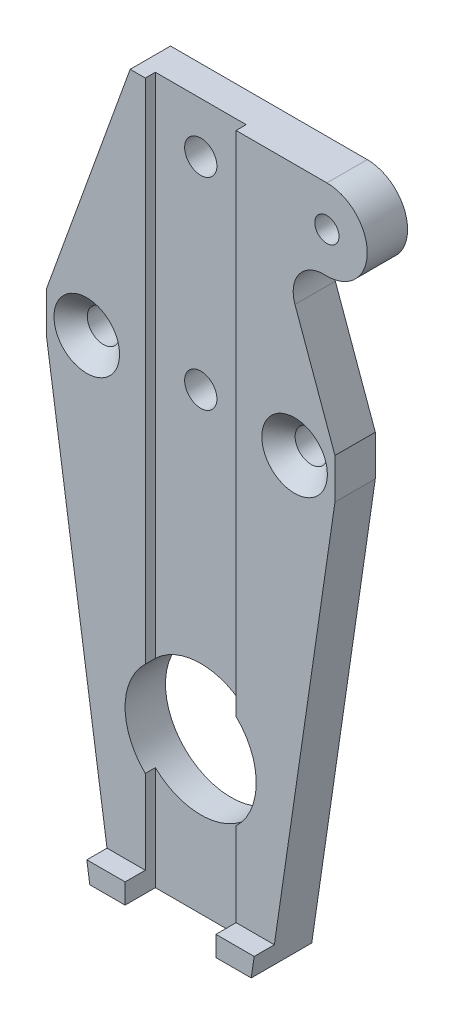
ISO-10303-21;
HEADER;
FILE_DESCRIPTION(('STEP AP214'),'2;1');
FILE_NAME('part.step','',(''),(''),'','','');
FILE_SCHEMA(('AUTOMOTIVE_DESIGN { 1 0 10303 214 1 1 1 1 }'));
ENDSEC;
DATA;
#1=APPLICATION_CONTEXT('core data for automotive mechanical design processes');
#2=APPLICATION_PROTOCOL_DEFINITION('international standard','automotive_design',2000,#1);
#3=PRODUCT_CONTEXT('',#1,'mechanical');
#4=PRODUCT('Part','Part','',(#3));
#5=PRODUCT_RELATED_PRODUCT_CATEGORY('part','',(#4));
#6=PRODUCT_DEFINITION_FORMATION('','',#4);
#7=PRODUCT_DEFINITION_CONTEXT('part definition',#1,'design');
#8=PRODUCT_DEFINITION('design','',#6,#7);
#9=PRODUCT_DEFINITION_SHAPE('','',#8);
#10=(LENGTH_UNIT() NAMED_UNIT(*) SI_UNIT(.MILLI.,.METRE.));
#11=(NAMED_UNIT(*) PLANE_ANGLE_UNIT() SI_UNIT($,.RADIAN.));
#12=(NAMED_UNIT(*) SI_UNIT($,.STERADIAN.) SOLID_ANGLE_UNIT());
#13=UNCERTAINTY_MEASURE_WITH_UNIT(LENGTH_MEASURE(1.E-05),#10,'distance_accuracy_value','');
#14=(GEOMETRIC_REPRESENTATION_CONTEXT(3) GLOBAL_UNCERTAINTY_ASSIGNED_CONTEXT((#13)) GLOBAL_UNIT_ASSIGNED_CONTEXT((#10,
#11,#12)) REPRESENTATION_CONTEXT('',''));
#15=CARTESIAN_POINT('',(0.,0.,0.));
#16=DIRECTION('',(0.,0.,1.));
#17=DIRECTION('',(1.,0.,0.));
#18=AXIS2_PLACEMENT_3D('',#15,#16,#17);
#19=CARTESIAN_POINT('',(0.,0.,3.));
#20=DIRECTION('',(0.,0.,1.));
#21=DIRECTION('',(1.,0.,0.));
#22=AXIS2_PLACEMENT_3D('',#19,#20,#21);
#23=PLANE('',#22);
#24=DIRECTION('',(-1.,0.,0.));
#25=VECTOR('',#24,1.);
#26=CARTESIAN_POINT('',(0.,-37.5454545454545,3.));
#27=LINE('',#26,#25);
#28=CARTESIAN_POINT('',(28.040606060556,-37.5454545454545,3.));
#29=VERTEX_POINT('',#28);
#30=CARTESIAN_POINT('',(19.0406060605561,-37.5454545454545,3.));
#31=VERTEX_POINT('',#30);
#32=EDGE_CURVE('E561',#29,#31,#27,.T.);
#33=ORIENTED_EDGE('',*,*,#32,.F.);
#34=DIRECTION('',(0.,1.,0.));
#35=VECTOR('',#34,1.);
#36=CARTESIAN_POINT('',(28.040606060556,0.,3.));
#37=LINE('',#36,#35);
#38=CARTESIAN_POINT('',(28.040606060556,-27.2358703052891,3.));
#39=VERTEX_POINT('',#38);
#40=EDGE_CURVE('E419',#29,#39,#37,.T.);
#41=ORIENTED_EDGE('',*,*,#40,.T.);
#42=CARTESIAN_POINT('',(23.5406060605519,-22.545454545429,3.));
#43=DIRECTION('',(0.,0.,1.));
#44=DIRECTION('',(1.,0.,0.));
#45=AXIS2_PLACEMENT_3D('',#42,#43,#44);
#46=CIRCLE('',#45,6.49999999997106);
#47=CARTESIAN_POINT('',(19.0406060605561,-27.2358703052163,3.));
#48=VERTEX_POINT('',#47);
#49=EDGE_CURVE('E406',#48,#39,#46,.T.);
#50=ORIENTED_EDGE('',*,*,#49,.F.);
#51=DIRECTION('',(0.,1.,0.));
#52=VECTOR('',#51,1.);
#53=CARTESIAN_POINT('',(19.0406060605561,0.,3.));
#54=LINE('',#53,#52);
#55=EDGE_CURVE('E147',#31,#48,#54,.T.);
#56=ORIENTED_EDGE('',*,*,#55,.F.);
#57=EDGE_LOOP('',(#33,#41,#50,#56));
#58=FACE_BOUND('',#57,.T.);
#59=ADVANCED_FACE('F132',(#58),#23,.T.);
#60=CARTESIAN_POINT('',(0.,0.,4.));
#61=DIRECTION('',(0.,0.,1.));
#62=DIRECTION('',(1.,0.,0.));
#63=AXIS2_PLACEMENT_3D('',#60,#61,#62);
#64=PLANE('',#63);
#65=CARTESIAN_POINT('',(33.8406060605526,7.45454545454557,4.));
#66=DIRECTION('',(0.,0.,1.));
#67=DIRECTION('',(1.,0.,0.));
#68=AXIS2_PLACEMENT_3D('',#65,#66,#67);
#69=CIRCLE('',#68,3.24999999999999);
#70=CARTESIAN_POINT('',(37.0906060605525,7.45454545454557,4.));
#71=VERTEX_POINT('',#70);
#72=EDGE_CURVE('E284',#71,#71,#69,.F.);
#73=ORIENTED_EDGE('',*,*,#72,.T.);
#74=EDGE_LOOP('',(#73));
#75=FACE_BOUND('',#74,.T.);
#76=CARTESIAN_POINT('',(37.0406060606563,28.4545454545455,4.));
#77=DIRECTION('',(0.,0.,1.));
#78=DIRECTION('',(1.,0.,0.));
#79=AXIS2_PLACEMENT_3D('',#76,#77,#78);
#80=CIRCLE('',#79,1.20000000000005);
#81=CARTESIAN_POINT('',(38.2406060606563,28.4545454545455,4.));
#82=VERTEX_POINT('',#81);
#83=EDGE_CURVE('E237',#82,#82,#80,.T.);
#84=ORIENTED_EDGE('',*,*,#83,.F.);
#85=EDGE_LOOP('',(#84));
#86=FACE_BOUND('',#85,.T.);
#87=CARTESIAN_POINT('',(23.5406060605519,-22.545454545429,4.));
#88=DIRECTION('',(0.,0.,1.));
#89=DIRECTION('',(1.,0.,0.));
#90=AXIS2_PLACEMENT_3D('',#87,#88,#89);
#91=CIRCLE('',#90,6.49999999997106);
#92=CARTESIAN_POINT('',(28.040606060556,-27.2358703052891,4.));
#93=VERTEX_POINT('',#92);
#94=CARTESIAN_POINT('',(28.040606060556,-17.8550387855671,4.));
#95=VERTEX_POINT('',#94);
#96=EDGE_CURVE('E267',#93,#95,#91,.T.);
#97=ORIENTED_EDGE('',*,*,#96,.F.);
#98=DIRECTION('',(0.,1.,0.));
#99=VECTOR('',#98,1.);
#100=CARTESIAN_POINT('',(28.040606060556,0.,4.));
#101=LINE('',#100,#99);
#102=CARTESIAN_POINT('',(28.0406060603391,-35.5454545454544,4.));
#103=VERTEX_POINT('',#102);
#104=EDGE_CURVE('E423',#103,#93,#101,.T.);
#105=ORIENTED_EDGE('',*,*,#104,.F.);
#106=DIRECTION('',(1.,-1.31715607146005E-13,0.));
#107=VECTOR('',#106,1.);
#108=CARTESIAN_POINT('',(-4.68189112673478E-12,-35.5454545454508,4.));
#109=LINE('',#108,#107);
#110=CARTESIAN_POINT('',(31.8336293163268,-35.545454545455,4.));
#111=VERTEX_POINT('',#110);
#112=EDGE_CURVE('E429',#103,#111,#109,.T.);
#113=ORIENTED_EDGE('',*,*,#112,.T.);
#114=DIRECTION('',(0.144964015023223,0.989436927928378,0.));
#115=VECTOR('',#114,1.);
#116=CARTESIAN_POINT('',(36.263041707377,-5.31295727344885,4.));
#117=LINE('',#116,#115);
#118=CARTESIAN_POINT('',(37.8406060605561,5.45454545451283,4.));
#119=VERTEX_POINT('',#118);
#120=EDGE_CURVE('E431',#111,#119,#117,.T.);
#121=ORIENTED_EDGE('',*,*,#120,.T.);
#122=DIRECTION('',(0.,1.,0.));
#123=VECTOR('',#122,1.);
#124=CARTESIAN_POINT('',(37.8406060605559,-1.05028780285499E-12,4.));
#125=LINE('',#124,#123);
#126=CARTESIAN_POINT('',(37.8406060605562,9.45454545451283,4.));
#127=VERTEX_POINT('',#126);
#128=EDGE_CURVE('E437',#119,#127,#125,.T.);
#129=ORIENTED_EDGE('',*,*,#128,.T.);
#130=DIRECTION('',(0.339443461497206,-0.940626459571915,0.));
#131=VECTOR('',#130,1.);
#132=CARTESIAN_POINT('',(36.4992780165337,13.1714785885564,4.));
#133=LINE('',#132,#131);
#134=CARTESIAN_POINT('',(33.8776557209874,20.4362150702011,4.));
#135=VERTEX_POINT('',#134);
#136=EDGE_CURVE('E439',#135,#127,#133,.T.);
#137=ORIENTED_EDGE('',*,*,#136,.F.);
#138=CARTESIAN_POINT('',(36.6995351004983,21.4545454540245,4.));
#139=DIRECTION('',(0.,0.,1.));
#140=DIRECTION('',(1.,0.,0.));
#141=AXIS2_PLACEMENT_3D('',#138,#139,#140);
#142=CIRCLE('',#141,3.00000000052108);
#143=CARTESIAN_POINT('',(36.6995350994455,24.4545454545455,4.));
#144=VERTEX_POINT('',#143);
#145=EDGE_CURVE('E442',#144,#135,#142,.T.);
#146=ORIENTED_EDGE('',*,*,#145,.F.);
#147=DIRECTION('',(-1.,0.,0.));
#148=VECTOR('',#147,1.);
#149=CARTESIAN_POINT('',(0.,24.4545454545455,4.));
#150=LINE('',#149,#148);
#151=CARTESIAN_POINT('',(37.0406060607188,24.4545454545455,4.));
#152=VERTEX_POINT('',#151);
#153=EDGE_CURVE('E222',#152,#144,#150,.T.);
#154=ORIENTED_EDGE('',*,*,#153,.F.);
#155=CARTESIAN_POINT('',(37.0406060606563,28.4545454545455,4.));
#156=DIRECTION('',(0.,0.,1.));
#157=DIRECTION('',(1.,0.,0.));
#158=AXIS2_PLACEMENT_3D('',#155,#156,#157);
#159=CIRCLE('',#158,3.99999999999998);
#160=CARTESIAN_POINT('',(37.0406060605939,32.4545454545455,4.));
#161=VERTEX_POINT('',#160);
#162=EDGE_CURVE('E216',#152,#161,#159,.T.);
#163=ORIENTED_EDGE('',*,*,#162,.T.);
#164=DIRECTION('',(1.,0.,0.));
#165=VECTOR('',#164,1.);
#166=CARTESIAN_POINT('',(0.,32.4545454545455,4.));
#167=LINE('',#166,#165);
#168=CARTESIAN_POINT('',(28.040606060556,32.4545454545455,4.));
#169=VERTEX_POINT('',#168);
#170=EDGE_CURVE('E219',#169,#161,#167,.T.);
#171=ORIENTED_EDGE('',*,*,#170,.F.);
#172=DIRECTION('',(0.,1.,0.));
#173=VECTOR('',#172,1.);
#174=CARTESIAN_POINT('',(28.040606060556,0.,4.));
#175=LINE('',#174,#173);
#176=EDGE_CURVE('E235',#95,#169,#175,.T.);
#177=ORIENTED_EDGE('',*,*,#176,.F.);
#178=EDGE_LOOP('',(#97,#105,#113,#121,#129,#137,#146,#154,#163,#171,#177));
#179=FACE_BOUND('',#178,.T.);
#180=ADVANCED_FACE('F217',(#75,#86,#179),#64,.T.);
#181=CARTESIAN_POINT('',(0.,0.,0.));
#182=DIRECTION('',(0.,0.,1.));
#183=DIRECTION('',(1.,0.,0.));
#184=AXIS2_PLACEMENT_3D('',#181,#182,#183);
#185=PLANE('',#184);
#186=DIRECTION('',(0.,1.,0.));
#187=VECTOR('',#186,1.);
#188=CARTESIAN_POINT('',(37.8406060605559,-1.05028780285499E-12,0.));
#189=LINE('',#188,#187);
#190=CARTESIAN_POINT('',(37.8406060605561,5.45454545451283,0.));
#191=VERTEX_POINT('',#190);
#192=CARTESIAN_POINT('',(37.8406060605562,9.45454545451283,0.));
#193=VERTEX_POINT('',#192);
#194=EDGE_CURVE('E249',#191,#193,#189,.T.);
#195=ORIENTED_EDGE('',*,*,#194,.F.);
#196=DIRECTION('',(0.144964015023223,0.989436927928378,0.));
#197=VECTOR('',#196,1.);
#198=CARTESIAN_POINT('',(36.263041707377,-5.31295727344885,0.));
#199=LINE('',#198,#197);
#200=CARTESIAN_POINT('',(31.5406060605105,-37.5454545454544,0.));
#201=VERTEX_POINT('',#200);
#202=EDGE_CURVE('E246',#201,#191,#199,.T.);
#203=ORIENTED_EDGE('',*,*,#202,.F.);
#204=DIRECTION('',(-1.,0.,0.));
#205=VECTOR('',#204,1.);
#206=CARTESIAN_POINT('',(0.,-37.5454545454545,0.));
#207=LINE('',#206,#205);
#208=CARTESIAN_POINT('',(15.5406060606017,-37.5454545454545,0.));
#209=VERTEX_POINT('',#208);
#210=EDGE_CURVE('E413',#201,#209,#207,.T.);
#211=ORIENTED_EDGE('',*,*,#210,.T.);
#212=DIRECTION('',(-0.144964015023226,0.989436927928378,0.));
#213=VECTOR('',#212,1.);
#214=CARTESIAN_POINT('',(9.82877919065661,1.44003043957285,0.));
#215=LINE('',#214,#213);
#216=CARTESIAN_POINT('',(9.24060606055605,5.45454545451281,0.));
#217=VERTEX_POINT('',#216);
#218=EDGE_CURVE('E481',#209,#217,#215,.T.);
#219=ORIENTED_EDGE('',*,*,#218,.T.);
#220=DIRECTION('',(0.,1.,0.));
#221=VECTOR('',#220,1.);
#222=CARTESIAN_POINT('',(9.24060606055605,0.,0.));
#223=LINE('',#222,#221);
#224=CARTESIAN_POINT('',(9.24060606055605,9.45454545451281,0.));
#225=VERTEX_POINT('',#224);
#226=EDGE_CURVE('E484',#217,#225,#223,.T.);
#227=ORIENTED_EDGE('',*,*,#226,.T.);
#228=DIRECTION('',(-0.33944346149721,-0.940626459571913,0.));
#229=VECTOR('',#228,1.);
#230=CARTESIAN_POINT('',(5.15714910564019,-1.861058155511,0.));
#231=LINE('',#230,#229);
#232=CARTESIAN_POINT('',(17.5406060605561,32.4545454545455,0.));
#233=VERTEX_POINT('',#232);
#234=EDGE_CURVE('E452',#233,#225,#231,.T.);
#235=ORIENTED_EDGE('',*,*,#234,.F.);
#236=DIRECTION('',(1.,0.,0.));
#237=VECTOR('',#236,1.);
#238=CARTESIAN_POINT('',(0.,32.4545454545455,0.));
#239=LINE('',#238,#237);
#240=CARTESIAN_POINT('',(37.0406060605939,32.4545454545455,0.));
#241=VERTEX_POINT('',#240);
#242=EDGE_CURVE('E262',#233,#241,#239,.T.);
#243=ORIENTED_EDGE('',*,*,#242,.T.);
#244=CARTESIAN_POINT('',(37.0406060606563,28.4545454545455,0.));
#245=DIRECTION('',(0.,0.,1.));
#246=DIRECTION('',(1.,0.,0.));
#247=AXIS2_PLACEMENT_3D('',#244,#245,#246);
#248=CIRCLE('',#247,3.99999999999998);
#249=CARTESIAN_POINT('',(37.0406060607188,24.4545454545455,0.));
#250=VERTEX_POINT('',#249);
#251=EDGE_CURVE('E227',#250,#241,#248,.T.);
#252=ORIENTED_EDGE('',*,*,#251,.F.);
#253=DIRECTION('',(-1.,0.,0.));
#254=VECTOR('',#253,1.);
#255=CARTESIAN_POINT('',(0.,24.4545454545455,0.));
#256=LINE('',#255,#254);
#257=CARTESIAN_POINT('',(36.6995350994455,24.4545454545455,0.));
#258=VERTEX_POINT('',#257);
#259=EDGE_CURVE('E258',#250,#258,#256,.T.);
#260=ORIENTED_EDGE('',*,*,#259,.T.);
#261=CARTESIAN_POINT('',(36.6995351004983,21.4545454540245,0.));
#262=DIRECTION('',(0.,0.,1.));
#263=DIRECTION('',(1.,0.,0.));
#264=AXIS2_PLACEMENT_3D('',#261,#262,#263);
#265=CIRCLE('',#264,3.00000000052108);
#266=CARTESIAN_POINT('',(33.8776557209874,20.4362150702011,0.));
#267=VERTEX_POINT('',#266);
#268=EDGE_CURVE('E255',#258,#267,#265,.T.);
#269=ORIENTED_EDGE('',*,*,#268,.T.);
#270=DIRECTION('',(0.339443461497206,-0.940626459571915,0.));
#271=VECTOR('',#270,1.);
#272=CARTESIAN_POINT('',(36.4992780165337,13.1714785885564,0.));
#273=LINE('',#272,#271);
#274=EDGE_CURVE('E252',#267,#193,#273,.T.);
#275=ORIENTED_EDGE('',*,*,#274,.T.);
#276=EDGE_LOOP('',(#195,#203,#211,#219,#227,#235,#243,#252,#260,#269,#275));
#277=FACE_BOUND('',#276,.T.);
#278=CARTESIAN_POINT('',(13.2406060605565,7.45454545454555,0.));
#279=DIRECTION('',(0.,0.,1.));
#280=DIRECTION('',(1.,0.,0.));
#281=AXIS2_PLACEMENT_3D('',#278,#279,#280);
#282=CIRCLE('',#281,1.6);
#283=CARTESIAN_POINT('',(14.8406060605565,7.45454545454555,0.));
#284=VERTEX_POINT('',#283);
#285=EDGE_CURVE('E488',#284,#284,#282,.T.);
#286=ORIENTED_EDGE('',*,*,#285,.T.);
#287=EDGE_LOOP('',(#286));
#288=FACE_BOUND('',#287,.T.);
#289=CARTESIAN_POINT('',(23.5406060605561,7.45454545454557,0.));
#290=DIRECTION('',(0.,0.,1.));
#291=DIRECTION('',(1.,0.,0.));
#292=AXIS2_PLACEMENT_3D('',#289,#290,#291);
#293=CIRCLE('',#292,1.60000000000002);
#294=CARTESIAN_POINT('',(25.1406060605561,7.45454545454557,0.));
#295=VERTEX_POINT('',#294);
#296=EDGE_CURVE('E511',#295,#295,#293,.T.);
#297=ORIENTED_EDGE('',*,*,#296,.T.);
#298=EDGE_LOOP('',(#297));
#299=FACE_BOUND('',#298,.T.);
#300=CARTESIAN_POINT('',(23.5406060605561,27.4545454545456,0.));
#301=DIRECTION('',(0.,0.,1.));
#302=DIRECTION('',(1.,0.,0.));
#303=AXIS2_PLACEMENT_3D('',#300,#301,#302);
#304=CIRCLE('',#303,1.60000000000002);
#305=CARTESIAN_POINT('',(25.1406060605561,27.4545454545456,0.));
#306=VERTEX_POINT('',#305);
#307=EDGE_CURVE('E525',#306,#306,#304,.T.);
#308=ORIENTED_EDGE('',*,*,#307,.T.);
#309=EDGE_LOOP('',(#308));
#310=FACE_BOUND('',#309,.T.);
#311=CARTESIAN_POINT('',(33.8406060605526,7.45454545454557,0.));
#312=DIRECTION('',(0.,0.,1.));
#313=DIRECTION('',(1.,0.,0.));
#314=AXIS2_PLACEMENT_3D('',#311,#312,#313);
#315=CIRCLE('',#314,1.6);
#316=CARTESIAN_POINT('',(35.4406060605525,7.45454545454557,0.));
#317=VERTEX_POINT('',#316);
#318=EDGE_CURVE('E247',#317,#317,#315,.T.);
#319=ORIENTED_EDGE('',*,*,#318,.T.);
#320=EDGE_LOOP('',(#319));
#321=FACE_BOUND('',#320,.T.);
#322=CARTESIAN_POINT('',(37.0406060606563,28.4545454545455,0.));
#323=DIRECTION('',(0.,0.,1.));
#324=DIRECTION('',(1.,0.,0.));
#325=AXIS2_PLACEMENT_3D('',#322,#323,#324);
#326=CIRCLE('',#325,1.20000000000005);
#327=CARTESIAN_POINT('',(38.2406060606563,28.4545454545455,0.));
#328=VERTEX_POINT('',#327);
#329=EDGE_CURVE('E264',#328,#328,#326,.T.);
#330=ORIENTED_EDGE('',*,*,#329,.T.);
#331=EDGE_LOOP('',(#330));
#332=FACE_BOUND('',#331,.T.);
#333=CARTESIAN_POINT('',(23.5406060605519,-22.545454545429,0.));
#334=DIRECTION('',(0.,0.,1.));
#335=DIRECTION('',(1.,0.,0.));
#336=AXIS2_PLACEMENT_3D('',#333,#334,#335);
#337=CIRCLE('',#336,6.49999999997106);
#338=CARTESIAN_POINT('',(30.040606060523,-22.545454545429,0.));
#339=VERTEX_POINT('',#338);
#340=EDGE_CURVE('E243',#339,#339,#337,.T.);
#341=ORIENTED_EDGE('',*,*,#340,.T.);
#342=EDGE_LOOP('',(#341));
#343=FACE_BOUND('',#342,.T.);
#344=ADVANCED_FACE('F307',(#277,#288,#299,#310,#321,#332,#343),#185,.F.);
#345=CARTESIAN_POINT('',(23.5406060605519,-22.545454545429,4.));
#346=DIRECTION('',(0.,0.,-1.));
#347=DIRECTION('',(-1.,0.,0.));
#348=AXIS2_PLACEMENT_3D('',#345,#346,#347);
#349=CYLINDRICAL_SURFACE('',#348,6.49999999997106);
#350=ORIENTED_EDGE('',*,*,#340,.F.);
#351=EDGE_LOOP('',(#350));
#352=FACE_BOUND('',#351,.T.);
#353=ORIENTED_EDGE('',*,*,#49,.T.);
#354=DIRECTION('',(0.,0.,-1.));
#355=VECTOR('',#354,1.);
#356=CARTESIAN_POINT('',(28.040606060556,-27.2358703052891,4.));
#357=LINE('',#356,#355);
#358=EDGE_CURVE('E193',#93,#39,#357,.T.);
#359=ORIENTED_EDGE('',*,*,#358,.F.);
#360=ORIENTED_EDGE('',*,*,#96,.T.);
#361=DIRECTION('',(0.,0.,-1.));
#362=VECTOR('',#361,1.);
#363=CARTESIAN_POINT('',(28.040606060556,-17.8550387855671,4.));
#364=LINE('',#363,#362);
#365=CARTESIAN_POINT('',(28.040606060556,-17.8550387855671,3.));
#366=VERTEX_POINT('',#365);
#367=EDGE_CURVE('E156',#95,#366,#364,.T.);
#368=ORIENTED_EDGE('',*,*,#367,.T.);
#369=CARTESIAN_POINT('',(23.5406060605519,-22.545454545429,3.));
#370=DIRECTION('',(0.,0.,1.));
#371=DIRECTION('',(1.,0.,0.));
#372=AXIS2_PLACEMENT_3D('',#369,#370,#371);
#373=CIRCLE('',#372,6.49999999997106);
#374=CARTESIAN_POINT('',(19.0406060605561,-17.8550387856416,3.));
#375=VERTEX_POINT('',#374);
#376=EDGE_CURVE('E507',#366,#375,#373,.T.);
#377=ORIENTED_EDGE('',*,*,#376,.T.);
#378=DIRECTION('',(0.,0.,-1.));
#379=VECTOR('',#378,1.);
#380=CARTESIAN_POINT('',(19.0406060605561,-17.8550387856416,4.));
#381=LINE('',#380,#379);
#382=CARTESIAN_POINT('',(19.0406060605561,-17.8550387856416,4.));
#383=VERTEX_POINT('',#382);
#384=EDGE_CURVE('E473',#383,#375,#381,.T.);
#385=ORIENTED_EDGE('',*,*,#384,.F.);
#386=CARTESIAN_POINT('',(23.5406060605519,-22.545454545429,4.));
#387=DIRECTION('',(0.,0.,1.));
#388=DIRECTION('',(1.,0.,0.));
#389=AXIS2_PLACEMENT_3D('',#386,#387,#388);
#390=CIRCLE('',#389,6.49999999997106);
#391=CARTESIAN_POINT('',(19.0406060605561,-27.2358703052163,4.));
#392=VERTEX_POINT('',#391);
#393=EDGE_CURVE('E485',#383,#392,#390,.T.);
#394=ORIENTED_EDGE('',*,*,#393,.T.);
#395=DIRECTION('',(0.,0.,-1.));
#396=VECTOR('',#395,1.);
#397=CARTESIAN_POINT('',(19.0406060605561,-27.2358703052163,4.));
#398=LINE('',#397,#396);
#399=EDGE_CURVE('E408',#392,#48,#398,.T.);
#400=ORIENTED_EDGE('',*,*,#399,.T.);
#401=EDGE_LOOP('',(#353,#359,#360,#368,#377,#385,#394,#400));
#402=FACE_BOUND('',#401,.T.);
#403=ADVANCED_FACE('F363',(#352,#402),#349,.F.);
#404=CARTESIAN_POINT('',(28.040606060556,0.,4.));
#405=DIRECTION('',(-1.,0.,0.));
#406=DIRECTION('',(0.,0.,1.));
#407=AXIS2_PLACEMENT_3D('',#404,#405,#406);
#408=PLANE('',#407);
#409=ORIENTED_EDGE('',*,*,#40,.F.);
#410=DIRECTION('',(0.,0.,-1.));
#411=VECTOR('',#410,1.);
#412=CARTESIAN_POINT('',(28.040606060556,-37.5454545454545,6.));
#413=LINE('',#412,#411);
#414=CARTESIAN_POINT('',(28.040606060556,-37.5454545454545,6.));
#415=VERTEX_POINT('',#414);
#416=EDGE_CURVE('E592',#415,#29,#413,.T.);
#417=ORIENTED_EDGE('',*,*,#416,.F.);
#418=DIRECTION('',(0.,1.,0.));
#419=VECTOR('',#418,1.);
#420=CARTESIAN_POINT('',(28.040606060556,0.,6.));
#421=LINE('',#420,#419);
#422=CARTESIAN_POINT('',(28.0406060603391,-35.5454545454544,6.));
#423=VERTEX_POINT('',#422);
#424=EDGE_CURVE('E594',#415,#423,#421,.T.);
#425=ORIENTED_EDGE('',*,*,#424,.T.);
#426=DIRECTION('',(0.,0.,-1.));
#427=VECTOR('',#426,1.);
#428=CARTESIAN_POINT('',(28.0406060603391,-35.5454545454544,6.));
#429=LINE('',#428,#427);
#430=EDGE_CURVE('E427',#423,#103,#429,.T.);
#431=ORIENTED_EDGE('',*,*,#430,.T.);
#432=ORIENTED_EDGE('',*,*,#104,.T.);
#433=ORIENTED_EDGE('',*,*,#358,.T.);
#434=EDGE_LOOP('',(#409,#417,#425,#431,#432,#433));
#435=FACE_BOUND('',#434,.T.);
#436=ADVANCED_FACE('F394',(#435),#408,.T.);
#437=CARTESIAN_POINT('',(36.263041707377,-5.31295727344885,4.));
#438=DIRECTION('',(-0.989436927928378,0.144964015023223,0.));
#439=DIRECTION('',(-0.144964015023223,-0.989436927928378,0.));
#440=AXIS2_PLACEMENT_3D('',#437,#438,#439);
#441=PLANE('',#440);
#442=ORIENTED_EDGE('',*,*,#120,.F.);
#443=DIRECTION('',(0.,0.,-1.));
#444=VECTOR('',#443,1.);
#445=CARTESIAN_POINT('',(31.8336293163268,-35.545454545455,6.));
#446=LINE('',#445,#444);
#447=CARTESIAN_POINT('',(31.8336293163268,-35.545454545455,6.));
#448=VERTEX_POINT('',#447);
#449=EDGE_CURVE('E588',#448,#111,#446,.T.);
#450=ORIENTED_EDGE('',*,*,#449,.F.);
#451=DIRECTION('',(0.144964015023223,0.989436927928378,0.));
#452=VECTOR('',#451,1.);
#453=CARTESIAN_POINT('',(36.263041707377,-5.31295727344885,6.));
#454=LINE('',#453,#452);
#455=CARTESIAN_POINT('',(31.5406060605105,-37.5454545454544,6.));
#456=VERTEX_POINT('',#455);
#457=EDGE_CURVE('E599',#456,#448,#454,.T.);
#458=ORIENTED_EDGE('',*,*,#457,.F.);
#459=DIRECTION('',(0.,0.,-1.));
#460=VECTOR('',#459,1.);
#461=CARTESIAN_POINT('',(31.5406060605105,-37.5454545454544,3.));
#462=LINE('',#461,#460);
#463=EDGE_CURVE('E553',#456,#201,#462,.T.);
#464=ORIENTED_EDGE('',*,*,#463,.T.);
#465=ORIENTED_EDGE('',*,*,#202,.T.);
#466=DIRECTION('',(0.,0.,-1.));
#467=VECTOR('',#466,1.);
#468=CARTESIAN_POINT('',(37.8406060605561,5.45454545451283,4.));
#469=LINE('',#468,#467);
#470=EDGE_CURVE('E277',#119,#191,#469,.T.);
#471=ORIENTED_EDGE('',*,*,#470,.F.);
#472=EDGE_LOOP('',(#442,#450,#458,#464,#465,#471));
#473=FACE_BOUND('',#472,.T.);
#474=ADVANCED_FACE('F390',(#473),#441,.F.);
#475=CARTESIAN_POINT('',(37.8406060605559,-1.05028780285499E-12,4.));
#476=DIRECTION('',(-1.,0.,0.));
#477=DIRECTION('',(0.,-1.,0.));
#478=AXIS2_PLACEMENT_3D('',#475,#476,#477);
#479=PLANE('',#478);
#480=ORIENTED_EDGE('',*,*,#194,.T.);
#481=DIRECTION('',(0.,0.,-1.));
#482=VECTOR('',#481,1.);
#483=CARTESIAN_POINT('',(37.8406060605562,9.45454545451283,4.));
#484=LINE('',#483,#482);
#485=EDGE_CURVE('E275',#127,#193,#484,.T.);
#486=ORIENTED_EDGE('',*,*,#485,.F.);
#487=ORIENTED_EDGE('',*,*,#128,.F.);
#488=ORIENTED_EDGE('',*,*,#470,.T.);
#489=EDGE_LOOP('',(#480,#486,#487,#488));
#490=FACE_BOUND('',#489,.T.);
#491=ADVANCED_FACE('F386',(#490),#479,.F.);
#492=CARTESIAN_POINT('',(36.4992780165337,13.1714785885564,4.));
#493=DIRECTION('',(0.940626459571915,0.339443461497206,0.));
#494=DIRECTION('',(-0.339443461497206,0.940626459571915,0.));
#495=AXIS2_PLACEMENT_3D('',#492,#493,#494);
#496=PLANE('',#495);
#497=ORIENTED_EDGE('',*,*,#274,.F.);
#498=DIRECTION('',(0.,0.,-1.));
#499=VECTOR('',#498,1.);
#500=CARTESIAN_POINT('',(33.8776557209874,20.4362150702011,4.));
#501=LINE('',#500,#499);
#502=EDGE_CURVE('E273',#135,#267,#501,.T.);
#503=ORIENTED_EDGE('',*,*,#502,.F.);
#504=ORIENTED_EDGE('',*,*,#136,.T.);
#505=ORIENTED_EDGE('',*,*,#485,.T.);
#506=EDGE_LOOP('',(#497,#503,#504,#505));
#507=FACE_BOUND('',#506,.T.);
#508=ADVANCED_FACE('F382',(#507),#496,.T.);
#509=CARTESIAN_POINT('',(36.6995351004983,21.4545454540245,4.));
#510=DIRECTION('',(0.,0.,-1.));
#511=DIRECTION('',(-1.,0.,0.));
#512=AXIS2_PLACEMENT_3D('',#509,#510,#511);
#513=CYLINDRICAL_SURFACE('',#512,3.00000000052108);
#514=ORIENTED_EDGE('',*,*,#268,.F.);
#515=DIRECTION('',(0.,0.,-1.));
#516=VECTOR('',#515,1.);
#517=CARTESIAN_POINT('',(36.6995350994455,24.4545454545455,4.));
#518=LINE('',#517,#516);
#519=EDGE_CURVE('E271',#144,#258,#518,.T.);
#520=ORIENTED_EDGE('',*,*,#519,.F.);
#521=ORIENTED_EDGE('',*,*,#145,.T.);
#522=ORIENTED_EDGE('',*,*,#502,.T.);
#523=EDGE_LOOP('',(#514,#520,#521,#522));
#524=FACE_BOUND('',#523,.T.);
#525=ADVANCED_FACE('F378',(#524),#513,.F.);
#526=CARTESIAN_POINT('',(0.,24.4545454545455,4.));
#527=DIRECTION('',(0.,-1.,0.));
#528=DIRECTION('',(0.,0.,-1.));
#529=AXIS2_PLACEMENT_3D('',#526,#527,#528);
#530=PLANE('',#529);
#531=ORIENTED_EDGE('',*,*,#259,.F.);
#532=DIRECTION('',(0.,0.,-1.));
#533=VECTOR('',#532,1.);
#534=CARTESIAN_POINT('',(37.0406060607188,24.4545454545455,4.));
#535=LINE('',#534,#533);
#536=EDGE_CURVE('E229',#152,#250,#535,.T.);
#537=ORIENTED_EDGE('',*,*,#536,.F.);
#538=ORIENTED_EDGE('',*,*,#153,.T.);
#539=ORIENTED_EDGE('',*,*,#519,.T.);
#540=EDGE_LOOP('',(#531,#537,#538,#539));
#541=FACE_BOUND('',#540,.T.);
#542=ADVANCED_FACE('F375',(#541),#530,.T.);
#543=CARTESIAN_POINT('',(37.0406060606563,28.4545454545455,4.));
#544=DIRECTION('',(0.,0.,-1.));
#545=DIRECTION('',(-1.,0.,0.));
#546=AXIS2_PLACEMENT_3D('',#543,#544,#545);
#547=CYLINDRICAL_SURFACE('',#546,3.99999999999998);
#548=ORIENTED_EDGE('',*,*,#251,.T.);
#549=DIRECTION('',(0.,0.,-1.));
#550=VECTOR('',#549,1.);
#551=CARTESIAN_POINT('',(37.0406060605939,32.4545454545455,4.));
#552=LINE('',#551,#550);
#553=EDGE_CURVE('E185',#161,#241,#552,.T.);
#554=ORIENTED_EDGE('',*,*,#553,.F.);
#555=ORIENTED_EDGE('',*,*,#162,.F.);
#556=ORIENTED_EDGE('',*,*,#536,.T.);
#557=EDGE_LOOP('',(#548,#554,#555,#556));
#558=FACE_BOUND('',#557,.T.);
#559=ADVANCED_FACE('F225',(#558),#547,.T.);
#560=CARTESIAN_POINT('',(0.,32.4545454545455,4.));
#561=DIRECTION('',(0.,1.,0.));
#562=DIRECTION('',(0.,0.,1.));
#563=AXIS2_PLACEMENT_3D('',#560,#561,#562);
#564=PLANE('',#563);
#565=ORIENTED_EDGE('',*,*,#242,.F.);
#566=DIRECTION('',(0.,0.,-1.));
#567=VECTOR('',#566,1.);
#568=CARTESIAN_POINT('',(17.5406060605561,32.4545454545455,4.));
#569=LINE('',#568,#567);
#570=CARTESIAN_POINT('',(17.5406060605561,32.4545454545455,4.));
#571=VERTEX_POINT('',#570);
#572=EDGE_CURVE('E457',#571,#233,#569,.T.);
#573=ORIENTED_EDGE('',*,*,#572,.F.);
#574=DIRECTION('',(1.,0.,0.));
#575=VECTOR('',#574,1.);
#576=CARTESIAN_POINT('',(0.,32.4545454545455,4.));
#577=LINE('',#576,#575);
#578=CARTESIAN_POINT('',(19.0406060605561,32.4545454545455,4.));
#579=VERTEX_POINT('',#578);
#580=EDGE_CURVE('E501',#571,#579,#577,.T.);
#581=ORIENTED_EDGE('',*,*,#580,.T.);
#582=DIRECTION('',(0.,0.,-1.));
#583=VECTOR('',#582,1.);
#584=CARTESIAN_POINT('',(19.0406060605561,32.4545454545455,4.));
#585=LINE('',#584,#583);
#586=CARTESIAN_POINT('',(19.0406060605561,32.4545454545455,3.));
#587=VERTEX_POINT('',#586);
#588=EDGE_CURVE('E467',#579,#587,#585,.T.);
#589=ORIENTED_EDGE('',*,*,#588,.T.);
#590=DIRECTION('',(1.,0.,0.));
#591=VECTOR('',#590,1.);
#592=CARTESIAN_POINT('',(0.,32.4545454545455,3.));
#593=LINE('',#592,#591);
#594=CARTESIAN_POINT('',(28.040606060556,32.4545454545455,3.));
#595=VERTEX_POINT('',#594);
#596=EDGE_CURVE('E514',#587,#595,#593,.T.);
#597=ORIENTED_EDGE('',*,*,#596,.T.);
#598=DIRECTION('',(0.,0.,-1.));
#599=VECTOR('',#598,1.);
#600=CARTESIAN_POINT('',(28.040606060556,32.4545454545455,4.));
#601=LINE('',#600,#599);
#602=EDGE_CURVE('E230',#169,#595,#601,.T.);
#603=ORIENTED_EDGE('',*,*,#602,.F.);
#604=ORIENTED_EDGE('',*,*,#170,.T.);
#605=ORIENTED_EDGE('',*,*,#553,.T.);
#606=EDGE_LOOP('',(#565,#573,#581,#589,#597,#603,#604,#605));
#607=FACE_BOUND('',#606,.T.);
#608=ADVANCED_FACE('F232',(#607),#564,.T.);
#609=CARTESIAN_POINT('',(28.040606060556,0.,4.));
#610=DIRECTION('',(-1.,0.,0.));
#611=DIRECTION('',(0.,0.,1.));
#612=AXIS2_PLACEMENT_3D('',#609,#610,#611);
#613=PLANE('',#612);
#614=DIRECTION('',(0.,1.,0.));
#615=VECTOR('',#614,1.);
#616=CARTESIAN_POINT('',(28.040606060556,0.,3.));
#617=LINE('',#616,#615);
#618=EDGE_CURVE('E510',#366,#595,#617,.T.);
#619=ORIENTED_EDGE('',*,*,#618,.F.);
#620=ORIENTED_EDGE('',*,*,#367,.F.);
#621=ORIENTED_EDGE('',*,*,#176,.T.);
#622=ORIENTED_EDGE('',*,*,#602,.T.);
#623=EDGE_LOOP('',(#619,#620,#621,#622));
#624=FACE_BOUND('',#623,.T.);
#625=ADVANCED_FACE('F367',(#624),#613,.T.);
#626=CARTESIAN_POINT('',(37.0406060606563,28.4545454545455,4.));
#627=DIRECTION('',(0.,0.,-1.));
#628=DIRECTION('',(-1.,0.,0.));
#629=AXIS2_PLACEMENT_3D('',#626,#627,#628);
#630=CYLINDRICAL_SURFACE('',#629,1.20000000000005);
#631=ORIENTED_EDGE('',*,*,#83,.T.);
#632=EDGE_LOOP('',(#631));
#633=FACE_BOUND('',#632,.T.);
#634=ORIENTED_EDGE('',*,*,#329,.F.);
#635=EDGE_LOOP('',(#634));
#636=FACE_BOUND('',#635,.T.);
#637=ADVANCED_FACE('F358',(#633,#636),#630,.F.);
#638=CARTESIAN_POINT('',(33.8406060605526,7.45454545454557,4.));
#639=DIRECTION('',(0.,0.,-1.));
#640=DIRECTION('',(-1.,0.,0.));
#641=AXIS2_PLACEMENT_3D('',#638,#639,#640);
#642=CYLINDRICAL_SURFACE('',#641,1.6);
#643=CARTESIAN_POINT('',(33.8406060605526,7.45454545454557,2.35000000000002));
#644=DIRECTION('',(0.,0.,1.));
#645=DIRECTION('',(1.,0.,0.));
#646=AXIS2_PLACEMENT_3D('',#643,#644,#645);
#647=CIRCLE('',#646,1.6);
#648=CARTESIAN_POINT('',(35.4406060605525,7.45454545454557,2.35000000000002));
#649=VERTEX_POINT('',#648);
#650=EDGE_CURVE('E281',#649,#649,#647,.T.);
#651=ORIENTED_EDGE('',*,*,#650,.T.);
#652=EDGE_LOOP('',(#651));
#653=FACE_BOUND('',#652,.T.);
#654=ORIENTED_EDGE('',*,*,#318,.F.);
#655=EDGE_LOOP('',(#654));
#656=FACE_BOUND('',#655,.T.);
#657=ADVANCED_FACE('F355',(#653,#656),#642,.F.);
#658=CARTESIAN_POINT('',(23.5406060605561,27.4545454545456,3.));
#659=DIRECTION('',(0.,0.,-1.));
#660=DIRECTION('',(-1.,0.,0.));
#661=AXIS2_PLACEMENT_3D('',#658,#659,#660);
#662=CYLINDRICAL_SURFACE('',#661,1.60000000000002);
#663=CARTESIAN_POINT('',(23.5406060605561,27.4545454545456,3.));
#664=DIRECTION('',(0.,0.,1.));
#665=DIRECTION('',(1.,0.,0.));
#666=AXIS2_PLACEMENT_3D('',#663,#664,#665);
#667=CIRCLE('',#666,1.60000000000002);
#668=CARTESIAN_POINT('',(25.1406060605561,27.4545454545456,3.));
#669=VERTEX_POINT('',#668);
#670=EDGE_CURVE('E519',#669,#669,#667,.T.);
#671=ORIENTED_EDGE('',*,*,#670,.T.);
#672=EDGE_LOOP('',(#671));
#673=FACE_BOUND('',#672,.T.);
#674=ORIENTED_EDGE('',*,*,#307,.F.);
#675=EDGE_LOOP('',(#674));
#676=FACE_BOUND('',#675,.T.);
#677=ADVANCED_FACE('F351',(#673,#676),#662,.F.);
#678=CARTESIAN_POINT('',(23.5406060605561,7.45454545454557,3.));
#679=DIRECTION('',(0.,0.,-1.));
#680=DIRECTION('',(-1.,0.,0.));
#681=AXIS2_PLACEMENT_3D('',#678,#679,#680);
#682=CYLINDRICAL_SURFACE('',#681,1.60000000000002);
#683=CARTESIAN_POINT('',(23.5406060605561,7.45454545454557,3.));
#684=DIRECTION('',(0.,0.,1.));
#685=DIRECTION('',(1.,0.,0.));
#686=AXIS2_PLACEMENT_3D('',#683,#684,#685);
#687=CIRCLE('',#686,1.60000000000002);
#688=CARTESIAN_POINT('',(25.1406060605561,7.45454545454557,3.));
#689=VERTEX_POINT('',#688);
#690=EDGE_CURVE('E522',#689,#689,#687,.T.);
#691=ORIENTED_EDGE('',*,*,#690,.T.);
#692=EDGE_LOOP('',(#691));
#693=FACE_BOUND('',#692,.T.);
#694=ORIENTED_EDGE('',*,*,#296,.F.);
#695=EDGE_LOOP('',(#694));
#696=FACE_BOUND('',#695,.T.);
#697=ADVANCED_FACE('F347',(#693,#696),#682,.F.);
#698=CARTESIAN_POINT('',(0.,0.,3.));
#699=DIRECTION('',(0.,0.,1.));
#700=DIRECTION('',(1.,0.,0.));
#701=AXIS2_PLACEMENT_3D('',#698,#699,#700);
#702=PLANE('',#701);
#703=ORIENTED_EDGE('',*,*,#376,.F.);
#704=ORIENTED_EDGE('',*,*,#618,.T.);
#705=ORIENTED_EDGE('',*,*,#596,.F.);
#706=DIRECTION('',(0.,1.,0.));
#707=VECTOR('',#706,1.);
#708=CARTESIAN_POINT('',(19.0406060605561,0.,3.));
#709=LINE('',#708,#707);
#710=EDGE_CURVE('E516',#375,#587,#709,.T.);
#711=ORIENTED_EDGE('',*,*,#710,.F.);
#712=EDGE_LOOP('',(#703,#704,#705,#711));
#713=FACE_BOUND('',#712,.T.);
#714=ORIENTED_EDGE('',*,*,#670,.F.);
#715=EDGE_LOOP('',(#714));
#716=FACE_BOUND('',#715,.T.);
#717=ORIENTED_EDGE('',*,*,#690,.F.);
#718=EDGE_LOOP('',(#717));
#719=FACE_BOUND('',#718,.T.);
#720=ADVANCED_FACE('F326',(#713,#716,#719),#702,.T.);
#721=CARTESIAN_POINT('',(19.0406060605561,0.,4.));
#722=DIRECTION('',(-1.,0.,0.));
#723=DIRECTION('',(0.,0.,1.));
#724=AXIS2_PLACEMENT_3D('',#721,#722,#723);
#725=PLANE('',#724);
#726=ORIENTED_EDGE('',*,*,#710,.T.);
#727=ORIENTED_EDGE('',*,*,#588,.F.);
#728=DIRECTION('',(0.,1.,0.));
#729=VECTOR('',#728,1.);
#730=CARTESIAN_POINT('',(19.0406060605561,0.,4.));
#731=LINE('',#730,#729);
#732=EDGE_CURVE('E503',#383,#579,#731,.T.);
#733=ORIENTED_EDGE('',*,*,#732,.F.);
#734=ORIENTED_EDGE('',*,*,#384,.T.);
#735=EDGE_LOOP('',(#726,#727,#733,#734));
#736=FACE_BOUND('',#735,.T.);
#737=ADVANCED_FACE('F322',(#736),#725,.F.);
#738=CARTESIAN_POINT('',(5.15714910564019,-1.861058155511,4.));
#739=DIRECTION('',(0.940626459571913,-0.33944346149721,0.));
#740=DIRECTION('',(0.33944346149721,0.940626459571913,0.));
#741=AXIS2_PLACEMENT_3D('',#738,#739,#740);
#742=PLANE('',#741);
#743=ORIENTED_EDGE('',*,*,#234,.T.);
#744=DIRECTION('',(0.,0.,-1.));
#745=VECTOR('',#744,1.);
#746=CARTESIAN_POINT('',(9.24060606055605,9.45454545451281,4.));
#747=LINE('',#746,#745);
#748=CARTESIAN_POINT('',(9.24060606055605,9.45454545451281,4.));
#749=VERTEX_POINT('',#748);
#750=EDGE_CURVE('E466',#749,#225,#747,.T.);
#751=ORIENTED_EDGE('',*,*,#750,.F.);
#752=DIRECTION('',(-0.33944346149721,-0.940626459571913,0.));
#753=VECTOR('',#752,1.);
#754=CARTESIAN_POINT('',(5.15714910564019,-1.861058155511,4.));
#755=LINE('',#754,#753);
#756=EDGE_CURVE('E464',#571,#749,#755,.T.);
#757=ORIENTED_EDGE('',*,*,#756,.F.);
#758=ORIENTED_EDGE('',*,*,#572,.T.);
#759=EDGE_LOOP('',(#743,#751,#757,#758));
#760=FACE_BOUND('',#759,.T.);
#761=ADVANCED_FACE('F325',(#760),#742,.F.);
#762=CARTESIAN_POINT('',(9.24060606055605,0.,4.));
#763=DIRECTION('',(-1.,0.,0.));
#764=DIRECTION('',(0.,0.,1.));
#765=AXIS2_PLACEMENT_3D('',#762,#763,#764);
#766=PLANE('',#765);
#767=ORIENTED_EDGE('',*,*,#226,.F.);
#768=DIRECTION('',(0.,0.,-1.));
#769=VECTOR('',#768,1.);
#770=CARTESIAN_POINT('',(9.24060606055605,5.45454545451281,4.));
#771=LINE('',#770,#769);
#772=CARTESIAN_POINT('',(9.24060606055605,5.45454545451281,4.));
#773=VERTEX_POINT('',#772);
#774=EDGE_CURVE('E470',#773,#217,#771,.T.);
#775=ORIENTED_EDGE('',*,*,#774,.F.);
#776=DIRECTION('',(0.,1.,0.));
#777=VECTOR('',#776,1.);
#778=CARTESIAN_POINT('',(9.24060606055605,0.,4.));
#779=LINE('',#778,#777);
#780=EDGE_CURVE('E497',#773,#749,#779,.T.);
#781=ORIENTED_EDGE('',*,*,#780,.T.);
#782=ORIENTED_EDGE('',*,*,#750,.T.);
#783=EDGE_LOOP('',(#767,#775,#781,#782));
#784=FACE_BOUND('',#783,.T.);
#785=ADVANCED_FACE('F330',(#784),#766,.T.);
#786=CARTESIAN_POINT('',(9.82877919065661,1.44003043957285,4.));
#787=DIRECTION('',(-0.989436927928378,-0.144964015023226,0.));
#788=DIRECTION('',(0.144964015023226,-0.989436927928378,0.));
#789=AXIS2_PLACEMENT_3D('',#786,#787,#788);
#790=PLANE('',#789);
#791=ORIENTED_EDGE('',*,*,#774,.T.);
#792=ORIENTED_EDGE('',*,*,#218,.F.);
#793=DIRECTION('',(0.,0.,-1.));
#794=VECTOR('',#793,1.);
#795=CARTESIAN_POINT('',(15.5406060606017,-37.5454545454545,3.));
#796=LINE('',#795,#794);
#797=CARTESIAN_POINT('',(15.5406060606017,-37.5454545454545,6.));
#798=VERTEX_POINT('',#797);
#799=EDGE_CURVE('E547',#798,#209,#796,.T.);
#800=ORIENTED_EDGE('',*,*,#799,.F.);
#801=DIRECTION('',(-0.144964015023226,0.989436927928378,0.));
#802=VECTOR('',#801,1.);
#803=CARTESIAN_POINT('',(9.82877919065661,1.44003043957285,6.));
#804=LINE('',#803,#802);
#805=CARTESIAN_POINT('',(15.2475828047855,-35.5454545454549,6.));
#806=VERTEX_POINT('',#805);
#807=EDGE_CURVE('E579',#798,#806,#804,.T.);
#808=ORIENTED_EDGE('',*,*,#807,.T.);
#809=DIRECTION('',(0.,0.,-1.));
#810=VECTOR('',#809,1.);
#811=CARTESIAN_POINT('',(15.2475828047855,-35.5454545454549,6.));
#812=LINE('',#811,#810);
#813=CARTESIAN_POINT('',(15.2475828047855,-35.5454545454549,4.));
#814=VERTEX_POINT('',#813);
#815=EDGE_CURVE('E572',#806,#814,#812,.T.);
#816=ORIENTED_EDGE('',*,*,#815,.T.);
#817=DIRECTION('',(-0.144964015023226,0.989436927928378,0.));
#818=VECTOR('',#817,1.);
#819=CARTESIAN_POINT('',(9.82877919065661,1.44003043957285,4.));
#820=LINE('',#819,#818);
#821=EDGE_CURVE('E494',#814,#773,#820,.T.);
#822=ORIENTED_EDGE('',*,*,#821,.T.);
#823=EDGE_LOOP('',(#791,#792,#800,#808,#816,#822));
#824=FACE_BOUND('',#823,.T.);
#825=ADVANCED_FACE('F334',(#824),#790,.T.);
#826=CARTESIAN_POINT('',(19.0406060605561,0.,4.));
#827=DIRECTION('',(-1.,0.,0.));
#828=DIRECTION('',(0.,0.,1.));
#829=AXIS2_PLACEMENT_3D('',#826,#827,#828);
#830=PLANE('',#829);
#831=DIRECTION('',(0.,1.,0.));
#832=VECTOR('',#831,1.);
#833=CARTESIAN_POINT('',(19.0406060605561,0.,4.));
#834=LINE('',#833,#832);
#835=CARTESIAN_POINT('',(19.0406060605561,-35.5454545454547,4.));
#836=VERTEX_POINT('',#835);
#837=EDGE_CURVE('E480',#836,#392,#834,.T.);
#838=ORIENTED_EDGE('',*,*,#837,.F.);
#839=DIRECTION('',(0.,0.,-1.));
#840=VECTOR('',#839,1.);
#841=CARTESIAN_POINT('',(19.0406060605561,-35.5454545454547,6.));
#842=LINE('',#841,#840);
#843=CARTESIAN_POINT('',(19.0406060605561,-35.5454545454547,6.));
#844=VERTEX_POINT('',#843);
#845=EDGE_CURVE('E565',#844,#836,#842,.T.);
#846=ORIENTED_EDGE('',*,*,#845,.F.);
#847=DIRECTION('',(0.,1.,0.));
#848=VECTOR('',#847,1.);
#849=CARTESIAN_POINT('',(19.0406060605561,0.,6.));
#850=LINE('',#849,#848);
#851=CARTESIAN_POINT('',(19.0406060605561,-37.5454545454545,6.));
#852=VERTEX_POINT('',#851);
#853=EDGE_CURVE('E585',#852,#844,#850,.T.);
#854=ORIENTED_EDGE('',*,*,#853,.F.);
#855=DIRECTION('',(0.,0.,-1.));
#856=VECTOR('',#855,1.);
#857=CARTESIAN_POINT('',(19.0406060605561,-37.5454545454545,6.));
#858=LINE('',#857,#856);
#859=EDGE_CURVE('E575',#852,#31,#858,.T.);
#860=ORIENTED_EDGE('',*,*,#859,.T.);
#861=ORIENTED_EDGE('',*,*,#55,.T.);
#862=ORIENTED_EDGE('',*,*,#399,.F.);
#863=EDGE_LOOP('',(#838,#846,#854,#860,#861,#862));
#864=FACE_BOUND('',#863,.T.);
#865=ADVANCED_FACE('F338',(#864),#830,.F.);
#866=CARTESIAN_POINT('',(0.,0.,4.));
#867=DIRECTION('',(0.,0.,1.));
#868=DIRECTION('',(1.,0.,0.));
#869=AXIS2_PLACEMENT_3D('',#866,#867,#868);
#870=PLANE('',#869);
#871=CARTESIAN_POINT('',(13.2406060605565,7.45454545454555,4.));
#872=DIRECTION('',(0.,0.,1.));
#873=DIRECTION('',(1.,0.,0.));
#874=AXIS2_PLACEMENT_3D('',#871,#872,#873);
#875=CIRCLE('',#874,3.25000000000001);
#876=CARTESIAN_POINT('',(16.4906060605565,7.45454545454555,4.));
#877=VERTEX_POINT('',#876);
#878=EDGE_CURVE('E12',#877,#877,#875,.F.);
#879=ORIENTED_EDGE('',*,*,#878,.T.);
#880=EDGE_LOOP('',(#879));
#881=FACE_BOUND('',#880,.T.);
#882=ORIENTED_EDGE('',*,*,#393,.F.);
#883=ORIENTED_EDGE('',*,*,#732,.T.);
#884=ORIENTED_EDGE('',*,*,#580,.F.);
#885=ORIENTED_EDGE('',*,*,#756,.T.);
#886=ORIENTED_EDGE('',*,*,#780,.F.);
#887=ORIENTED_EDGE('',*,*,#821,.F.);
#888=DIRECTION('',(-1.,-1.28056840280835E-13,0.));
#889=VECTOR('',#888,1.);
#890=CARTESIAN_POINT('',(4.55183859543727E-12,-35.5454545454569,4.));
#891=LINE('',#890,#889);
#892=EDGE_CURVE('E491',#836,#814,#891,.T.);
#893=ORIENTED_EDGE('',*,*,#892,.F.);
#894=ORIENTED_EDGE('',*,*,#837,.T.);
#895=EDGE_LOOP('',(#882,#883,#884,#885,#886,#887,#893,#894));
#896=FACE_BOUND('',#895,.T.);
#897=ADVANCED_FACE('F321',(#881,#896),#870,.T.);
#898=CARTESIAN_POINT('',(13.2406060605565,7.45454545454555,4.));
#899=DIRECTION('',(0.,0.,-1.));
#900=DIRECTION('',(-1.,0.,0.));
#901=AXIS2_PLACEMENT_3D('',#898,#899,#900);
#902=CYLINDRICAL_SURFACE('',#901,1.6);
#903=CARTESIAN_POINT('',(13.2406060605565,7.45454545454555,2.35000000000001));
#904=DIRECTION('',(0.,0.,1.));
#905=DIRECTION('',(1.,0.,0.));
#906=AXIS2_PLACEMENT_3D('',#903,#904,#905);
#907=CIRCLE('',#906,1.6);
#908=CARTESIAN_POINT('',(14.8406060605565,7.45454545454555,2.35000000000001));
#909=VERTEX_POINT('',#908);
#910=EDGE_CURVE('E140',#909,#909,#907,.T.);
#911=ORIENTED_EDGE('',*,*,#910,.T.);
#912=EDGE_LOOP('',(#911));
#913=FACE_BOUND('',#912,.T.);
#914=ORIENTED_EDGE('',*,*,#285,.F.);
#915=EDGE_LOOP('',(#914));
#916=FACE_BOUND('',#915,.T.);
#917=ADVANCED_FACE('F289',(#913,#916),#902,.F.);
#918=CARTESIAN_POINT('',(0.,-37.5454545454545,3.));
#919=DIRECTION('',(0.,-1.,0.));
#920=DIRECTION('',(1.,0.,0.));
#921=AXIS2_PLACEMENT_3D('',#918,#919,#920);
#922=PLANE('',#921);
#923=ORIENTED_EDGE('',*,*,#799,.T.);
#924=ORIENTED_EDGE('',*,*,#210,.F.);
#925=ORIENTED_EDGE('',*,*,#463,.F.);
#926=DIRECTION('',(-1.,0.,0.));
#927=VECTOR('',#926,1.);
#928=CARTESIAN_POINT('',(0.,-37.5454545454545,6.));
#929=LINE('',#928,#927);
#930=EDGE_CURVE('E602',#456,#415,#929,.T.);
#931=ORIENTED_EDGE('',*,*,#930,.T.);
#932=ORIENTED_EDGE('',*,*,#416,.T.);
#933=ORIENTED_EDGE('',*,*,#32,.T.);
#934=ORIENTED_EDGE('',*,*,#859,.F.);
#935=DIRECTION('',(-1.,0.,0.));
#936=VECTOR('',#935,1.);
#937=CARTESIAN_POINT('',(0.,-37.5454545454545,6.));
#938=LINE('',#937,#936);
#939=EDGE_CURVE('E577',#852,#798,#938,.T.);
#940=ORIENTED_EDGE('',*,*,#939,.T.);
#941=EDGE_LOOP('',(#923,#924,#925,#931,#932,#933,#934,#940));
#942=FACE_BOUND('',#941,.T.);
#943=ADVANCED_FACE('F315',(#942),#922,.T.);
#944=CARTESIAN_POINT('',(4.55183859543727E-12,-35.5454545454569,6.));
#945=DIRECTION('',(1.28056840280835E-13,-1.,0.));
#946=DIRECTION('',(1.,1.28056840280835E-13,0.));
#947=AXIS2_PLACEMENT_3D('',#944,#945,#946);
#948=PLANE('',#947);
#949=ORIENTED_EDGE('',*,*,#892,.T.);
#950=ORIENTED_EDGE('',*,*,#815,.F.);
#951=DIRECTION('',(-1.,-1.28056840280835E-13,0.));
#952=VECTOR('',#951,1.);
#953=CARTESIAN_POINT('',(4.55183859543727E-12,-35.5454545454569,6.));
#954=LINE('',#953,#952);
#955=EDGE_CURVE('E582',#844,#806,#954,.T.);
#956=ORIENTED_EDGE('',*,*,#955,.F.);
#957=ORIENTED_EDGE('',*,*,#845,.T.);
#958=EDGE_LOOP('',(#949,#950,#956,#957));
#959=FACE_BOUND('',#958,.T.);
#960=ADVANCED_FACE('F313',(#959),#948,.F.);
#961=CARTESIAN_POINT('',(0.,0.,6.));
#962=DIRECTION('',(0.,0.,1.));
#963=DIRECTION('',(1.,0.,0.));
#964=AXIS2_PLACEMENT_3D('',#961,#962,#963);
#965=PLANE('',#964);
#966=ORIENTED_EDGE('',*,*,#853,.T.);
#967=ORIENTED_EDGE('',*,*,#955,.T.);
#968=ORIENTED_EDGE('',*,*,#807,.F.);
#969=ORIENTED_EDGE('',*,*,#939,.F.);
#970=EDGE_LOOP('',(#966,#967,#968,#969));
#971=FACE_BOUND('',#970,.T.);
#972=ADVANCED_FACE('F677',(#971),#965,.T.);
#973=CARTESIAN_POINT('',(-4.68189112673478E-12,-35.5454545454508,6.));
#974=DIRECTION('',(1.31715607146005E-13,1.,0.));
#975=DIRECTION('',(-1.,1.31715607146005E-13,0.));
#976=AXIS2_PLACEMENT_3D('',#973,#974,#975);
#977=PLANE('',#976);
#978=ORIENTED_EDGE('',*,*,#449,.T.);
#979=ORIENTED_EDGE('',*,*,#112,.F.);
#980=ORIENTED_EDGE('',*,*,#430,.F.);
#981=DIRECTION('',(1.,-1.31715607146005E-13,0.));
#982=VECTOR('',#981,1.);
#983=CARTESIAN_POINT('',(-4.68189112673478E-12,-35.5454545454508,6.));
#984=LINE('',#983,#982);
#985=EDGE_CURVE('E596',#423,#448,#984,.T.);
#986=ORIENTED_EDGE('',*,*,#985,.T.);
#987=EDGE_LOOP('',(#978,#979,#980,#986));
#988=FACE_BOUND('',#987,.T.);
#989=ADVANCED_FACE('F686',(#988),#977,.T.);
#990=CARTESIAN_POINT('',(0.,0.,6.));
#991=DIRECTION('',(0.,0.,1.));
#992=DIRECTION('',(1.,0.,0.));
#993=AXIS2_PLACEMENT_3D('',#990,#991,#992);
#994=PLANE('',#993);
#995=ORIENTED_EDGE('',*,*,#930,.F.);
#996=ORIENTED_EDGE('',*,*,#457,.T.);
#997=ORIENTED_EDGE('',*,*,#985,.F.);
#998=ORIENTED_EDGE('',*,*,#424,.F.);
#999=EDGE_LOOP('',(#995,#996,#997,#998));
#1000=FACE_BOUND('',#999,.T.);
#1001=ADVANCED_FACE('F298',(#1000),#994,.T.);
#1002=CARTESIAN_POINT('',(33.8406060605526,7.45454545454557,2.35000000000002));
#1003=DIRECTION('',(0.,0.,1.));
#1004=DIRECTION('',(1.,0.,0.));
#1005=AXIS2_PLACEMENT_3D('',#1002,#1003,#1004);
#1006=CONICAL_SURFACE('',#1005,1.6,0.785398163397453);
#1007=ORIENTED_EDGE('',*,*,#72,.F.);
#1008=EDGE_LOOP('',(#1007));
#1009=FACE_BOUND('',#1008,.T.);
#1010=ORIENTED_EDGE('',*,*,#650,.F.);
#1011=EDGE_LOOP('',(#1010));
#1012=FACE_BOUND('',#1011,.T.);
#1013=ADVANCED_FACE('F293',(#1009,#1012),#1006,.F.);
#1014=CARTESIAN_POINT('',(13.2406060605565,7.45454545454555,2.35000000000001));
#1015=DIRECTION('',(0.,0.,1.));
#1016=DIRECTION('',(1.,0.,0.));
#1017=AXIS2_PLACEMENT_3D('',#1014,#1015,#1016);
#1018=CONICAL_SURFACE('',#1017,1.6,0.785398163397453);
#1019=ORIENTED_EDGE('',*,*,#878,.F.);
#1020=EDGE_LOOP('',(#1019));
#1021=FACE_BOUND('',#1020,.T.);
#1022=ORIENTED_EDGE('',*,*,#910,.F.);
#1023=EDGE_LOOP('',(#1022));
#1024=FACE_BOUND('',#1023,.T.);
#1025=ADVANCED_FACE('F134',(#1021,#1024),#1018,.F.);
#1026=CLOSED_SHELL('',(#59,#180,#344,#403,#436,#474,#491,#508,#525,#542,#559,#608,#625,#637,
#657,#677,#697,#720,#737,#761,#785,#825,#865,#897,#917,#943,#960,#972,#989,#1001,#1013,#1025));
#1027=MANIFOLD_SOLID_BREP('B2',#1026);
#1028=ADVANCED_BREP_SHAPE_REPRESENTATION('',(#18,#1027),#14);
#1029=SHAPE_DEFINITION_REPRESENTATION(#9,#1028);
ENDSEC;
END-ISO-10303-21;
